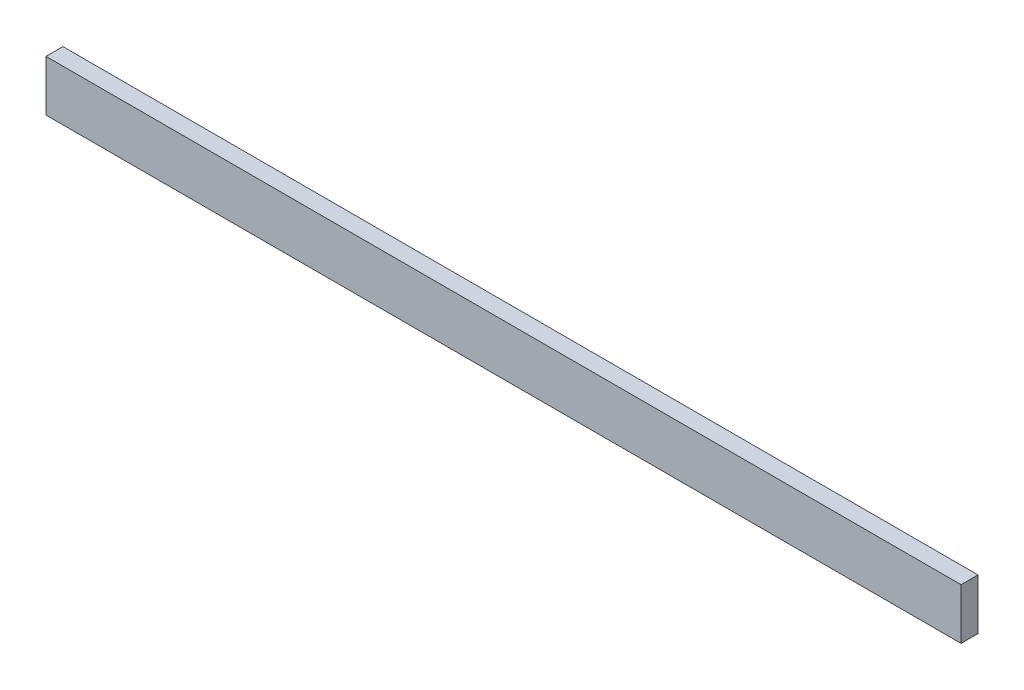
ISO-10303-21;
HEADER;
FILE_DESCRIPTION(('STEP AP214'),'2;1');
FILE_NAME('part.step','',(''),(''),'','','');
FILE_SCHEMA(('AUTOMOTIVE_DESIGN { 1 0 10303 214 1 1 1 1 }'));
ENDSEC;
DATA;
#1=APPLICATION_CONTEXT('core data for automotive mechanical design processes');
#2=APPLICATION_PROTOCOL_DEFINITION('international standard','automotive_design',2000,#1);
#3=PRODUCT_CONTEXT('',#1,'mechanical');
#4=PRODUCT('Part','Part','',(#3));
#5=PRODUCT_RELATED_PRODUCT_CATEGORY('part','',(#4));
#6=PRODUCT_DEFINITION_FORMATION('','',#4);
#7=PRODUCT_DEFINITION_CONTEXT('part definition',#1,'design');
#8=PRODUCT_DEFINITION('design','',#6,#7);
#9=PRODUCT_DEFINITION_SHAPE('','',#8);
#10=(LENGTH_UNIT() NAMED_UNIT(*) SI_UNIT(.MILLI.,.METRE.));
#11=(NAMED_UNIT(*) PLANE_ANGLE_UNIT() SI_UNIT($,.RADIAN.));
#12=(NAMED_UNIT(*) SI_UNIT($,.STERADIAN.) SOLID_ANGLE_UNIT());
#13=UNCERTAINTY_MEASURE_WITH_UNIT(LENGTH_MEASURE(1.E-05),#10,'distance_accuracy_value','');
#14=(GEOMETRIC_REPRESENTATION_CONTEXT(3) GLOBAL_UNCERTAINTY_ASSIGNED_CONTEXT((#13)) GLOBAL_UNIT_ASSIGNED_CONTEXT((#10,
#11,#12)) REPRESENTATION_CONTEXT('',''));
#15=CARTESIAN_POINT('',(0.,0.,0.));
#16=DIRECTION('',(0.,0.,1.));
#17=DIRECTION('',(1.,0.,0.));
#18=AXIS2_PLACEMENT_3D('',#15,#16,#17);
#19=CARTESIAN_POINT('',(0.,-3.,1.));
#20=DIRECTION('',(0.,1.,0.));
#21=DIRECTION('',(0.,0.,1.));
#22=AXIS2_PLACEMENT_3D('',#19,#20,#21);
#23=PLANE('',#22);
#24=DIRECTION('',(1.,0.,0.));
#25=VECTOR('',#24,1.);
#26=CARTESIAN_POINT('',(0.,-3.,0.));
#27=LINE('',#26,#25);
#28=CARTESIAN_POINT('',(0.,-3.,0.));
#29=VERTEX_POINT('',#28);
#30=CARTESIAN_POINT('',(54.,-3.,0.));
#31=VERTEX_POINT('',#30);
#32=EDGE_CURVE('E113',#29,#31,#27,.T.);
#33=ORIENTED_EDGE('',*,*,#32,.T.);
#34=DIRECTION('',(0.,0.,-1.));
#35=VECTOR('',#34,1.);
#36=CARTESIAN_POINT('',(54.,-3.,1.));
#37=LINE('',#36,#35);
#38=CARTESIAN_POINT('',(54.,-3.,1.));
#39=VERTEX_POINT('',#38);
#40=EDGE_CURVE('E11',#39,#31,#37,.T.);
#41=ORIENTED_EDGE('',*,*,#40,.F.);
#42=DIRECTION('',(1.,0.,0.));
#43=VECTOR('',#42,1.);
#44=CARTESIAN_POINT('',(0.,-3.,1.));
#45=LINE('',#44,#43);
#46=CARTESIAN_POINT('',(0.,-3.,1.));
#47=VERTEX_POINT('',#46);
#48=EDGE_CURVE('E86',#47,#39,#45,.T.);
#49=ORIENTED_EDGE('',*,*,#48,.F.);
#50=DIRECTION('',(0.,0.,-1.));
#51=VECTOR('',#50,1.);
#52=CARTESIAN_POINT('',(0.,-3.,1.));
#53=LINE('',#52,#51);
#54=EDGE_CURVE('E62',#47,#29,#53,.T.);
#55=ORIENTED_EDGE('',*,*,#54,.T.);
#56=EDGE_LOOP('',(#33,#41,#49,#55));
#57=FACE_BOUND('',#56,.T.);
#58=ADVANCED_FACE('F45',(#57),#23,.F.);
#59=CARTESIAN_POINT('',(54.,0.,1.));
#60=DIRECTION('',(1.,0.,0.));
#61=DIRECTION('',(0.,0.,-1.));
#62=AXIS2_PLACEMENT_3D('',#59,#60,#61);
#63=PLANE('',#62);
#64=DIRECTION('',(0.,-1.,0.));
#65=VECTOR('',#64,1.);
#66=CARTESIAN_POINT('',(54.,0.,0.));
#67=LINE('',#66,#65);
#68=CARTESIAN_POINT('',(54.,0.,0.));
#69=VERTEX_POINT('',#68);
#70=EDGE_CURVE('E95',#69,#31,#67,.T.);
#71=ORIENTED_EDGE('',*,*,#70,.F.);
#72=DIRECTION('',(0.,0.,-1.));
#73=VECTOR('',#72,1.);
#74=CARTESIAN_POINT('',(54.,0.,1.));
#75=LINE('',#74,#73);
#76=CARTESIAN_POINT('',(54.,0.,1.));
#77=VERTEX_POINT('',#76);
#78=EDGE_CURVE('E54',#77,#69,#75,.T.);
#79=ORIENTED_EDGE('',*,*,#78,.F.);
#80=DIRECTION('',(0.,-1.,0.));
#81=VECTOR('',#80,1.);
#82=CARTESIAN_POINT('',(54.,0.,1.));
#83=LINE('',#82,#81);
#84=EDGE_CURVE('E93',#77,#39,#83,.T.);
#85=ORIENTED_EDGE('',*,*,#84,.T.);
#86=ORIENTED_EDGE('',*,*,#40,.T.);
#87=EDGE_LOOP('',(#71,#79,#85,#86));
#88=FACE_BOUND('',#87,.T.);
#89=ADVANCED_FACE('F92',(#88),#63,.T.);
#90=CARTESIAN_POINT('',(0.,0.,1.));
#91=DIRECTION('',(0.,1.,0.));
#92=DIRECTION('',(0.,0.,1.));
#93=AXIS2_PLACEMENT_3D('',#90,#91,#92);
#94=PLANE('',#93);
#95=DIRECTION('',(1.,0.,0.));
#96=VECTOR('',#95,1.);
#97=CARTESIAN_POINT('',(0.,0.,0.));
#98=LINE('',#97,#96);
#99=CARTESIAN_POINT('',(0.,0.,0.));
#100=VERTEX_POINT('',#99);
#101=EDGE_CURVE('E118',#100,#69,#98,.T.);
#102=ORIENTED_EDGE('',*,*,#101,.F.);
#103=DIRECTION('',(0.,0.,-1.));
#104=VECTOR('',#103,1.);
#105=CARTESIAN_POINT('',(0.,0.,1.));
#106=LINE('',#105,#104);
#107=CARTESIAN_POINT('',(0.,0.,1.));
#108=VERTEX_POINT('',#107);
#109=EDGE_CURVE('E75',#108,#100,#106,.T.);
#110=ORIENTED_EDGE('',*,*,#109,.F.);
#111=DIRECTION('',(1.,0.,0.));
#112=VECTOR('',#111,1.);
#113=CARTESIAN_POINT('',(0.,0.,1.));
#114=LINE('',#113,#112);
#115=EDGE_CURVE('E102',#108,#77,#114,.T.);
#116=ORIENTED_EDGE('',*,*,#115,.T.);
#117=ORIENTED_EDGE('',*,*,#78,.T.);
#118=EDGE_LOOP('',(#102,#110,#116,#117));
#119=FACE_BOUND('',#118,.T.);
#120=ADVANCED_FACE('F105',(#119),#94,.T.);
#121=CARTESIAN_POINT('',(0.,-3.,1.));
#122=DIRECTION('',(-1.,0.,0.));
#123=DIRECTION('',(0.,0.,1.));
#124=AXIS2_PLACEMENT_3D('',#121,#122,#123);
#125=PLANE('',#124);
#126=DIRECTION('',(0.,1.,0.));
#127=VECTOR('',#126,1.);
#128=CARTESIAN_POINT('',(0.,-3.,0.));
#129=LINE('',#128,#127);
#130=EDGE_CURVE('E121',#29,#100,#129,.T.);
#131=ORIENTED_EDGE('',*,*,#130,.F.);
#132=ORIENTED_EDGE('',*,*,#54,.F.);
#133=DIRECTION('',(0.,1.,0.));
#134=VECTOR('',#133,1.);
#135=CARTESIAN_POINT('',(0.,-3.,1.));
#136=LINE('',#135,#134);
#137=EDGE_CURVE('E107',#47,#108,#136,.T.);
#138=ORIENTED_EDGE('',*,*,#137,.T.);
#139=ORIENTED_EDGE('',*,*,#109,.T.);
#140=EDGE_LOOP('',(#131,#132,#138,#139));
#141=FACE_BOUND('',#140,.T.);
#142=ADVANCED_FACE('F131',(#141),#125,.T.);
#143=CARTESIAN_POINT('',(0.,0.,1.));
#144=DIRECTION('',(0.,0.,-1.));
#145=DIRECTION('',(-1.,0.,0.));
#146=AXIS2_PLACEMENT_3D('',#143,#144,#145);
#147=PLANE('',#146);
#148=ORIENTED_EDGE('',*,*,#48,.T.);
#149=ORIENTED_EDGE('',*,*,#84,.F.);
#150=ORIENTED_EDGE('',*,*,#115,.F.);
#151=ORIENTED_EDGE('',*,*,#137,.F.);
#152=EDGE_LOOP('',(#148,#149,#150,#151));
#153=FACE_BOUND('',#152,.T.);
#154=ADVANCED_FACE('F101',(#153),#147,.F.);
#155=CARTESIAN_POINT('',(0.,0.,0.));
#156=DIRECTION('',(0.,0.,-1.));
#157=DIRECTION('',(-1.,0.,0.));
#158=AXIS2_PLACEMENT_3D('',#155,#156,#157);
#159=PLANE('',#158);
#160=ORIENTED_EDGE('',*,*,#32,.F.);
#161=ORIENTED_EDGE('',*,*,#130,.T.);
#162=ORIENTED_EDGE('',*,*,#101,.T.);
#163=ORIENTED_EDGE('',*,*,#70,.T.);
#164=EDGE_LOOP('',(#160,#161,#162,#163));
#165=FACE_BOUND('',#164,.T.);
#166=ADVANCED_FACE('F130',(#165),#159,.T.);
#167=CLOSED_SHELL('',(#58,#89,#120,#142,#154,#166));
#168=MANIFOLD_SOLID_BREP('B2',#167);
#169=ADVANCED_BREP_SHAPE_REPRESENTATION('',(#18,#168),#14);
#170=SHAPE_DEFINITION_REPRESENTATION(#9,#169);
ENDSEC;
END-ISO-10303-21;
